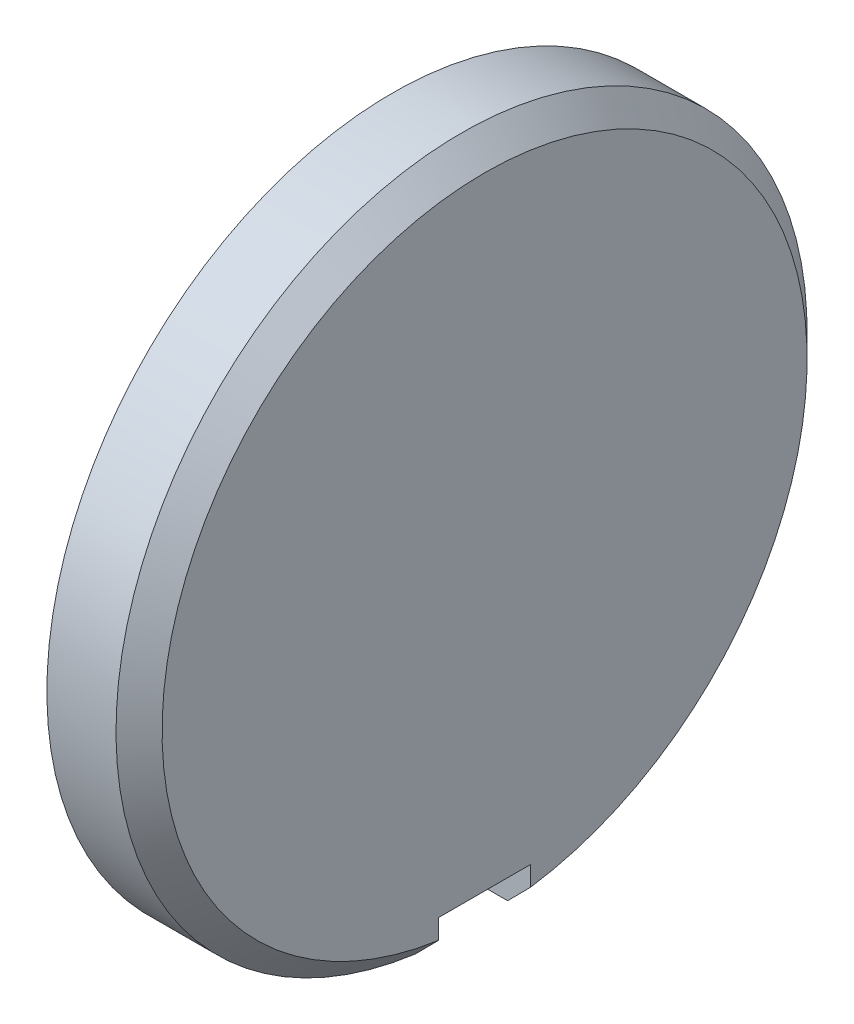
ISO-10303-21;
HEADER;
FILE_DESCRIPTION(('STEP AP214'),'2;1');
FILE_NAME('part.step','',(''),(''),'','','');
FILE_SCHEMA(('AUTOMOTIVE_DESIGN { 1 0 10303 214 1 1 1 1 }'));
ENDSEC;
DATA;
#1=APPLICATION_CONTEXT('core data for automotive mechanical design processes');
#2=APPLICATION_PROTOCOL_DEFINITION('international standard','automotive_design',2000,#1);
#3=PRODUCT_CONTEXT('',#1,'mechanical');
#4=PRODUCT('Part','Part','',(#3));
#5=PRODUCT_RELATED_PRODUCT_CATEGORY('part','',(#4));
#6=PRODUCT_DEFINITION_FORMATION('','',#4);
#7=PRODUCT_DEFINITION_CONTEXT('part definition',#1,'design');
#8=PRODUCT_DEFINITION('design','',#6,#7);
#9=PRODUCT_DEFINITION_SHAPE('','',#8);
#10=(LENGTH_UNIT() NAMED_UNIT(*) SI_UNIT(.MILLI.,.METRE.));
#11=(NAMED_UNIT(*) PLANE_ANGLE_UNIT() SI_UNIT($,.RADIAN.));
#12=(NAMED_UNIT(*) SI_UNIT($,.STERADIAN.) SOLID_ANGLE_UNIT());
#13=UNCERTAINTY_MEASURE_WITH_UNIT(LENGTH_MEASURE(1.E-05),#10,'distance_accuracy_value','');
#14=(GEOMETRIC_REPRESENTATION_CONTEXT(3) GLOBAL_UNCERTAINTY_ASSIGNED_CONTEXT((#13)) GLOBAL_UNIT_ASSIGNED_CONTEXT((#10,
#11,#12)) REPRESENTATION_CONTEXT('',''));
#15=CARTESIAN_POINT('',(0.,0.,0.));
#16=DIRECTION('',(0.,0.,1.));
#17=DIRECTION('',(1.,0.,0.));
#18=AXIS2_PLACEMENT_3D('',#15,#16,#17);
#19=CARTESIAN_POINT('',(76.8,-20.,66.));
#20=DIRECTION('',(-1.,0.,0.));
#21=DIRECTION('',(0.,0.,1.));
#22=AXIS2_PLACEMENT_3D('',#19,#20,#21);
#23=PLANE('',#22);
#24=DIRECTION('',(0.,-1.,0.));
#25=VECTOR('',#24,1.);
#26=CARTESIAN_POINT('',(76.8,-20.,66.8));
#27=LINE('',#26,#25);
#28=CARTESIAN_POINT('',(76.8,-25.2,66.8));
#29=VERTEX_POINT('',#28);
#30=CARTESIAN_POINT('',(76.8,-25.5425625842204,66.8));
#31=VERTEX_POINT('',#30);
#32=EDGE_CURVE('E210',#29,#31,#27,.T.);
#33=ORIENTED_EDGE('',*,*,#32,.F.);
#34=DIRECTION('',(0.,0.,1.));
#35=VECTOR('',#34,1.);
#36=CARTESIAN_POINT('',(76.8,-25.2,66.));
#37=LINE('',#36,#35);
#38=CARTESIAN_POINT('',(76.8,-25.2,65.2));
#39=VERTEX_POINT('',#38);
#40=EDGE_CURVE('E202',#39,#29,#37,.T.);
#41=ORIENTED_EDGE('',*,*,#40,.F.);
#42=DIRECTION('',(0.,-1.,0.));
#43=VECTOR('',#42,1.);
#44=CARTESIAN_POINT('',(76.8,-20.,65.2));
#45=LINE('',#44,#43);
#46=CARTESIAN_POINT('',(76.8,-25.5425625842204,65.2));
#47=VERTEX_POINT('',#46);
#48=EDGE_CURVE('E188',#39,#47,#45,.T.);
#49=ORIENTED_EDGE('',*,*,#48,.T.);
#50=CARTESIAN_POINT('',(76.8,-20.,66.));
#51=DIRECTION('',(-1.,0.,0.));
#52=DIRECTION('',(0.,0.,1.));
#53=AXIS2_PLACEMENT_3D('',#50,#51,#52);
#54=CIRCLE('',#53,5.6);
#55=EDGE_CURVE('E315',#31,#47,#54,.T.);
#56=ORIENTED_EDGE('',*,*,#55,.F.);
#57=EDGE_LOOP('',(#33,#41,#49,#56));
#58=FACE_BOUND('',#57,.T.);
#59=ADVANCED_FACE('F47',(#58),#23,.F.);
#60=CARTESIAN_POINT('',(76.8,-20.,66.));
#61=DIRECTION('',(-1.,0.,0.));
#62=DIRECTION('',(0.,0.,1.));
#63=AXIS2_PLACEMENT_3D('',#60,#61,#62);
#64=CONICAL_SURFACE('',#63,5.6,0.78539816339747);
#65=CARTESIAN_POINT('',(77.6946271909999,-24.6368667515551,66.8));
#66=CARTESIAN_POINT('',(77.5126166868986,-24.8215553370668,66.8));
#67=CARTESIAN_POINT('',(77.3304582431577,-25.0060979425621,66.8));
#68=CARTESIAN_POINT('',(76.9659108831408,-25.374955064313,66.8));
#69=CARTESIAN_POINT('',(76.7835219670777,-25.5592695807787,66.8));
#70=CARTESIAN_POINT('',(76.418578818597,-25.9277346494659,66.8));
#71=CARTESIAN_POINT('',(76.2360245862569,-26.1118852017641,66.8));
#72=CARTESIAN_POINT('',(75.8707866928955,-26.480058250433,66.8));
#73=CARTESIAN_POINT('',(75.6881030317566,-26.6640807466869,66.8));
#74=CARTESIAN_POINT('',(75.5053728090001,-26.8480569582091,66.8));
#75=B_SPLINE_CURVE_WITH_KNOTS('',3,(#65,#66,#67,#68,#69,#70,#71,#72,#73,#74),.UNSPECIFIED.,.F.,
.F.,(4,2,2,2,4),(0.,0.777906711944237,1.55581270618923,2.33371833583195,3.11162467374078),.UNSPECIFIED.);
#76=CARTESIAN_POINT('',(76.4,-25.9464274989274,66.8));
#77=VERTEX_POINT('',#76);
#78=EDGE_CURVE('E217',#31,#77,#75,.T.);
#79=ORIENTED_EDGE('',*,*,#78,.F.);
#80=ORIENTED_EDGE('',*,*,#55,.T.);
#81=CARTESIAN_POINT('',(77.6946271909999,-24.6368667515551,65.2));
#82=CARTESIAN_POINT('',(77.5126166868986,-24.8215553370668,65.2));
#83=CARTESIAN_POINT('',(77.3304582431577,-25.0060979425621,65.2));
#84=CARTESIAN_POINT('',(76.9659108831408,-25.374955064313,65.2));
#85=CARTESIAN_POINT('',(76.7835219670777,-25.5592695807787,65.2));
#86=CARTESIAN_POINT('',(76.418578818597,-25.9277346494659,65.2));
#87=CARTESIAN_POINT('',(76.2360245862569,-26.1118852017641,65.2));
#88=CARTESIAN_POINT('',(75.8707866928955,-26.480058250433,65.2));
#89=CARTESIAN_POINT('',(75.6881030317566,-26.6640807466869,65.2));
#90=CARTESIAN_POINT('',(75.5053728090001,-26.8480569582091,65.2));
#91=B_SPLINE_CURVE_WITH_KNOTS('',3,(#81,#82,#83,#84,#85,#86,#87,#88,#89,#90),.UNSPECIFIED.,.F.,
.F.,(4,2,2,2,4),(0.,0.777906711944237,1.55581270618923,2.33371833583195,3.11162467374078),.UNSPECIFIED.);
#92=CARTESIAN_POINT('',(76.4,-25.9464274989274,65.2));
#93=VERTEX_POINT('',#92);
#94=EDGE_CURVE('E191',#47,#93,#91,.T.);
#95=ORIENTED_EDGE('',*,*,#94,.T.);
#96=CARTESIAN_POINT('',(76.4,-20.,66.));
#97=DIRECTION('',(-1.,0.,0.));
#98=DIRECTION('',(0.,0.,1.));
#99=AXIS2_PLACEMENT_3D('',#96,#97,#98);
#100=CIRCLE('',#99,6.);
#101=EDGE_CURVE('E311',#77,#93,#100,.T.);
#102=ORIENTED_EDGE('',*,*,#101,.F.);
#103=EDGE_LOOP('',(#79,#80,#95,#102));
#104=FACE_BOUND('',#103,.T.);
#105=ADVANCED_FACE('F470',(#104),#64,.T.);
#106=CARTESIAN_POINT('',(69.,-20.,66.));
#107=DIRECTION('',(-1.,0.,0.));
#108=DIRECTION('',(0.,0.,1.));
#109=AXIS2_PLACEMENT_3D('',#106,#107,#108);
#110=CYLINDRICAL_SURFACE('',#109,6.);
#111=DIRECTION('',(-1.,0.,0.));
#112=VECTOR('',#111,1.);
#113=CARTESIAN_POINT('',(69.,-25.9464274989274,66.8));
#114=LINE('',#113,#112);
#115=CARTESIAN_POINT('',(75.2,-25.9464274989274,66.8));
#116=VERTEX_POINT('',#115);
#117=EDGE_CURVE('E197',#77,#116,#114,.T.);
#118=ORIENTED_EDGE('',*,*,#117,.F.);
#119=ORIENTED_EDGE('',*,*,#101,.T.);
#120=DIRECTION('',(-1.,0.,0.));
#121=VECTOR('',#120,1.);
#122=CARTESIAN_POINT('',(69.,-25.9464274989274,65.2));
#123=LINE('',#122,#121);
#124=CARTESIAN_POINT('',(75.2,-25.9464274989274,65.2));
#125=VERTEX_POINT('',#124);
#126=EDGE_CURVE('E679',#93,#125,#123,.T.);
#127=ORIENTED_EDGE('',*,*,#126,.T.);
#128=CARTESIAN_POINT('',(75.2,-20.,66.));
#129=DIRECTION('',(-1.,0.,0.));
#130=DIRECTION('',(0.,0.,1.));
#131=AXIS2_PLACEMENT_3D('',#128,#129,#130);
#132=CIRCLE('',#131,6.);
#133=EDGE_CURVE('E307',#116,#125,#132,.T.);
#134=ORIENTED_EDGE('',*,*,#133,.F.);
#135=EDGE_LOOP('',(#118,#119,#127,#134));
#136=FACE_BOUND('',#135,.T.);
#137=ADVANCED_FACE('F475',(#136),#110,.T.);
#138=CARTESIAN_POINT('',(75.2,-14.,66.));
#139=DIRECTION('',(1.,0.,0.));
#140=DIRECTION('',(0.,0.,-1.));
#141=AXIS2_PLACEMENT_3D('',#138,#139,#140);
#142=PLANE('',#141);
#143=CARTESIAN_POINT('',(75.2,-20.,66.));
#144=DIRECTION('',(-1.,0.,0.));
#145=DIRECTION('',(0.,0.,1.));
#146=AXIS2_PLACEMENT_3D('',#143,#144,#145);
#147=CIRCLE('',#146,3.);
#148=CARTESIAN_POINT('',(75.2,-20.,69.));
#149=VERTEX_POINT('',#148);
#150=EDGE_CURVE('E301',#149,#149,#147,.T.);
#151=ORIENTED_EDGE('',*,*,#150,.F.);
#152=EDGE_LOOP('',(#151));
#153=FACE_BOUND('',#152,.T.);
#154=DIRECTION('',(0.,1.,0.));
#155=VECTOR('',#154,1.);
#156=CARTESIAN_POINT('',(75.2,-14.,66.8));
#157=LINE('',#156,#155);
#158=CARTESIAN_POINT('',(75.2,-25.2,66.8));
#159=VERTEX_POINT('',#158);
#160=EDGE_CURVE('E11',#116,#159,#157,.T.);
#161=ORIENTED_EDGE('',*,*,#160,.F.);
#162=ORIENTED_EDGE('',*,*,#133,.T.);
#163=DIRECTION('',(0.,1.,0.));
#164=VECTOR('',#163,1.);
#165=CARTESIAN_POINT('',(75.2,-14.,65.2));
#166=LINE('',#165,#164);
#167=CARTESIAN_POINT('',(75.2,-25.2,65.2));
#168=VERTEX_POINT('',#167);
#169=EDGE_CURVE('E363',#125,#168,#166,.T.);
#170=ORIENTED_EDGE('',*,*,#169,.T.);
#171=DIRECTION('',(0.,0.,-1.));
#172=VECTOR('',#171,1.);
#173=CARTESIAN_POINT('',(75.2,-25.2,66.));
#174=LINE('',#173,#172);
#175=EDGE_CURVE('E56',#159,#168,#174,.T.);
#176=ORIENTED_EDGE('',*,*,#175,.F.);
#177=EDGE_LOOP('',(#161,#162,#170,#176));
#178=FACE_BOUND('',#177,.T.);
#179=ADVANCED_FACE('F498',(#153,#178),#142,.F.);
#180=CARTESIAN_POINT('',(74.,-17.,66.));
#181=DIRECTION('',(1.,0.,0.));
#182=DIRECTION('',(0.,0.,-1.));
#183=AXIS2_PLACEMENT_3D('',#180,#181,#182);
#184=PLANE('',#183);
#185=DIRECTION('',(0.,1.,0.));
#186=VECTOR('',#185,1.);
#187=CARTESIAN_POINT('',(74.,-17.,66.4));
#188=LINE('',#187,#186);
#189=CARTESIAN_POINT('',(74.,-22.9732137494637,66.4));
#190=VERTEX_POINT('',#189);
#191=CARTESIAN_POINT('',(74.,-22.2649503305812,66.4));
#192=VERTEX_POINT('',#191);
#193=EDGE_CURVE('E248',#190,#192,#188,.T.);
#194=ORIENTED_EDGE('',*,*,#193,.F.);
#195=CARTESIAN_POINT('',(74.,-20.,66.));
#196=DIRECTION('',(-1.,0.,0.));
#197=DIRECTION('',(0.,0.,1.));
#198=AXIS2_PLACEMENT_3D('',#195,#196,#197);
#199=CIRCLE('',#198,3.);
#200=CARTESIAN_POINT('',(74.,-20.4,68.9732137494637));
#201=VERTEX_POINT('',#200);
#202=EDGE_CURVE('E296',#190,#201,#199,.T.);
#203=ORIENTED_EDGE('',*,*,#202,.T.);
#204=DIRECTION('',(0.,0.,1.));
#205=VECTOR('',#204,1.);
#206=CARTESIAN_POINT('',(74.,-20.4,66.));
#207=LINE('',#206,#205);
#208=CARTESIAN_POINT('',(74.,-20.4,68.2649503305812));
#209=VERTEX_POINT('',#208);
#210=EDGE_CURVE('E284',#209,#201,#207,.T.);
#211=ORIENTED_EDGE('',*,*,#210,.F.);
#212=CARTESIAN_POINT('',(74.,-20.,66.));
#213=DIRECTION('',(-1.,0.,0.));
#214=DIRECTION('',(0.,0.,1.));
#215=AXIS2_PLACEMENT_3D('',#212,#213,#214);
#216=CIRCLE('',#215,2.3);
#217=EDGE_CURVE('E322',#192,#209,#216,.T.);
#218=ORIENTED_EDGE('',*,*,#217,.F.);
#219=EDGE_LOOP('',(#194,#203,#211,#218));
#220=FACE_BOUND('',#219,.T.);
#221=ADVANCED_FACE('F418',(#220),#184,.F.);
#222=DIRECTION('',(0.,1.,0.));
#223=VECTOR('',#222,1.);
#224=CARTESIAN_POINT('',(74.,-17.,66.4));
#225=LINE('',#224,#223);
#226=CARTESIAN_POINT('',(74.,-17.7350496694188,66.4));
#227=VERTEX_POINT('',#226);
#228=CARTESIAN_POINT('',(74.,-17.0267862505363,66.4));
#229=VERTEX_POINT('',#228);
#230=EDGE_CURVE('E242',#227,#229,#225,.T.);
#231=ORIENTED_EDGE('',*,*,#230,.F.);
#232=CARTESIAN_POINT('',(74.,-19.6,68.2649503305812));
#233=VERTEX_POINT('',#232);
#234=EDGE_CURVE('E323',#233,#227,#216,.T.);
#235=ORIENTED_EDGE('',*,*,#234,.F.);
#236=DIRECTION('',(0.,0.,-1.));
#237=VECTOR('',#236,1.);
#238=CARTESIAN_POINT('',(74.,-19.6,66.));
#239=LINE('',#238,#237);
#240=CARTESIAN_POINT('',(74.,-19.6,68.9732137494637));
#241=VERTEX_POINT('',#240);
#242=EDGE_CURVE('E273',#241,#233,#239,.T.);
#243=ORIENTED_EDGE('',*,*,#242,.F.);
#244=EDGE_CURVE('E297',#241,#229,#199,.T.);
#245=ORIENTED_EDGE('',*,*,#244,.T.);
#246=EDGE_LOOP('',(#231,#235,#243,#245));
#247=FACE_BOUND('',#246,.T.);
#248=ADVANCED_FACE('F436',(#247),#184,.F.);
#249=CARTESIAN_POINT('',(69.,-20.,66.));
#250=DIRECTION('',(-1.,0.,0.));
#251=DIRECTION('',(0.,0.,1.));
#252=AXIS2_PLACEMENT_3D('',#249,#250,#251);
#253=CYLINDRICAL_SURFACE('',#252,2.3);
#254=CARTESIAN_POINT('',(75.2,-20.,66.));
#255=DIRECTION('',(-1.,0.,0.));
#256=DIRECTION('',(0.,0.,1.));
#257=AXIS2_PLACEMENT_3D('',#254,#255,#256);
#258=CIRCLE('',#257,2.3);
#259=CARTESIAN_POINT('',(75.2,-20.,68.3));
#260=VERTEX_POINT('',#259);
#261=EDGE_CURVE('E318',#260,#260,#258,.T.);
#262=ORIENTED_EDGE('',*,*,#261,.F.);
#263=EDGE_LOOP('',(#262));
#264=FACE_BOUND('',#263,.T.);
#265=DIRECTION('',(-1.,0.,0.));
#266=VECTOR('',#265,1.);
#267=CARTESIAN_POINT('',(69.,-22.2649503305812,66.4));
#268=LINE('',#267,#266);
#269=CARTESIAN_POINT('',(75.18,-22.2649503305812,66.4));
#270=VERTEX_POINT('',#269);
#271=EDGE_CURVE('E251',#192,#270,#268,.F.);
#272=ORIENTED_EDGE('',*,*,#271,.F.);
#273=ORIENTED_EDGE('',*,*,#217,.T.);
#274=DIRECTION('',(-1.,0.,0.));
#275=VECTOR('',#274,1.);
#276=CARTESIAN_POINT('',(69.,-20.4,68.2649503305812));
#277=LINE('',#276,#275);
#278=CARTESIAN_POINT('',(75.18,-20.4,68.2649503305812));
#279=VERTEX_POINT('',#278);
#280=EDGE_CURVE('E288',#279,#209,#277,.T.);
#281=ORIENTED_EDGE('',*,*,#280,.F.);
#282=CARTESIAN_POINT('',(75.18,-20.,66.));
#283=DIRECTION('',(-1.,0.,0.));
#284=DIRECTION('',(0.,0.,1.));
#285=AXIS2_PLACEMENT_3D('',#282,#283,#284);
#286=CIRCLE('',#285,2.3);
#287=CARTESIAN_POINT('',(75.18,-19.6,68.2649503305812));
#288=VERTEX_POINT('',#287);
#289=EDGE_CURVE('E280',#288,#279,#286,.F.);
#290=ORIENTED_EDGE('',*,*,#289,.F.);
#291=DIRECTION('',(-1.,0.,0.));
#292=VECTOR('',#291,1.);
#293=CARTESIAN_POINT('',(69.,-19.6,68.2649503305812));
#294=LINE('',#293,#292);
#295=EDGE_CURVE('E277',#233,#288,#294,.F.);
#296=ORIENTED_EDGE('',*,*,#295,.F.);
#297=ORIENTED_EDGE('',*,*,#234,.T.);
#298=DIRECTION('',(-1.,0.,0.));
#299=VECTOR('',#298,1.);
#300=CARTESIAN_POINT('',(69.,-17.7350496694188,66.4));
#301=LINE('',#300,#299);
#302=CARTESIAN_POINT('',(75.18,-17.7350496694188,66.4));
#303=VERTEX_POINT('',#302);
#304=EDGE_CURVE('E245',#303,#227,#301,.T.);
#305=ORIENTED_EDGE('',*,*,#304,.F.);
#306=CARTESIAN_POINT('',(75.18,-20.,66.));
#307=DIRECTION('',(-1.,0.,0.));
#308=DIRECTION('',(0.,0.,1.));
#309=AXIS2_PLACEMENT_3D('',#306,#307,#308);
#310=CIRCLE('',#309,2.3);
#311=CARTESIAN_POINT('',(75.18,-17.7350496694188,65.6));
#312=VERTEX_POINT('',#311);
#313=EDGE_CURVE('E254',#312,#303,#310,.F.);
#314=ORIENTED_EDGE('',*,*,#313,.F.);
#315=DIRECTION('',(-1.,0.,0.));
#316=VECTOR('',#315,1.);
#317=CARTESIAN_POINT('',(69.,-17.7350496694188,65.6));
#318=LINE('',#317,#316);
#319=CARTESIAN_POINT('',(74.,-17.7350496694188,65.6));
#320=VERTEX_POINT('',#319);
#321=EDGE_CURVE('E230',#312,#320,#318,.T.);
#322=ORIENTED_EDGE('',*,*,#321,.T.);
#323=CARTESIAN_POINT('',(74.,-19.6,63.7350496694188));
#324=VERTEX_POINT('',#323);
#325=EDGE_CURVE('E328',#320,#324,#216,.T.);
#326=ORIENTED_EDGE('',*,*,#325,.T.);
#327=DIRECTION('',(-1.,0.,0.));
#328=VECTOR('',#327,1.);
#329=CARTESIAN_POINT('',(69.,-19.6,63.7350496694188));
#330=LINE('',#329,#328);
#331=CARTESIAN_POINT('',(75.18,-19.6,63.7350496694188));
#332=VERTEX_POINT('',#331);
#333=EDGE_CURVE('E272',#332,#324,#330,.T.);
#334=ORIENTED_EDGE('',*,*,#333,.F.);
#335=CARTESIAN_POINT('',(75.18,-20.4,63.7350496694188));
#336=VERTEX_POINT('',#335);
#337=EDGE_CURVE('E283',#336,#332,#286,.F.);
#338=ORIENTED_EDGE('',*,*,#337,.F.);
#339=DIRECTION('',(-1.,0.,0.));
#340=VECTOR('',#339,1.);
#341=CARTESIAN_POINT('',(69.,-20.4,63.7350496694188));
#342=LINE('',#341,#340);
#343=CARTESIAN_POINT('',(74.,-20.4,63.7350496694188));
#344=VERTEX_POINT('',#343);
#345=EDGE_CURVE('E293',#344,#336,#342,.F.);
#346=ORIENTED_EDGE('',*,*,#345,.F.);
#347=CARTESIAN_POINT('',(74.,-22.2649503305812,65.6));
#348=VERTEX_POINT('',#347);
#349=EDGE_CURVE('E329',#344,#348,#216,.T.);
#350=ORIENTED_EDGE('',*,*,#349,.T.);
#351=DIRECTION('',(-1.,0.,0.));
#352=VECTOR('',#351,1.);
#353=CARTESIAN_POINT('',(69.,-22.2649503305812,65.6));
#354=LINE('',#353,#352);
#355=CARTESIAN_POINT('',(75.18,-22.2649503305812,65.6));
#356=VERTEX_POINT('',#355);
#357=EDGE_CURVE('E238',#348,#356,#354,.F.);
#358=ORIENTED_EDGE('',*,*,#357,.T.);
#359=EDGE_CURVE('E257',#270,#356,#310,.F.);
#360=ORIENTED_EDGE('',*,*,#359,.F.);
#361=EDGE_LOOP('',(#272,#273,#281,#290,#296,#297,#305,#314,#322,#326,#334,#338,#346,#350,#358,#360));
#362=FACE_BOUND('',#361,.T.);
#363=ADVANCED_FACE('F397',(#264,#362),#253,.F.);
#364=CARTESIAN_POINT('',(69.,-20.,66.));
#365=DIRECTION('',(-1.,0.,0.));
#366=DIRECTION('',(0.,0.,1.));
#367=AXIS2_PLACEMENT_3D('',#364,#365,#366);
#368=CYLINDRICAL_SURFACE('',#367,3.);
#369=ORIENTED_EDGE('',*,*,#150,.T.);
#370=EDGE_LOOP('',(#369));
#371=FACE_BOUND('',#370,.T.);
#372=DIRECTION('',(-1.,0.,0.));
#373=VECTOR('',#372,1.);
#374=CARTESIAN_POINT('',(69.,-22.9732137494637,66.4));
#375=LINE('',#374,#373);
#376=CARTESIAN_POINT('',(75.18,-22.9732137494637,66.4));
#377=VERTEX_POINT('',#376);
#378=EDGE_CURVE('E360',#377,#190,#375,.T.);
#379=ORIENTED_EDGE('',*,*,#378,.F.);
#380=CARTESIAN_POINT('',(75.18,-20.,66.));
#381=DIRECTION('',(-1.,0.,0.));
#382=DIRECTION('',(0.,0.,1.));
#383=AXIS2_PLACEMENT_3D('',#380,#381,#382);
#384=CIRCLE('',#383,3.);
#385=CARTESIAN_POINT('',(75.18,-22.9732137494637,65.6));
#386=VERTEX_POINT('',#385);
#387=EDGE_CURVE('E353',#386,#377,#384,.T.);
#388=ORIENTED_EDGE('',*,*,#387,.F.);
#389=DIRECTION('',(-1.,0.,0.));
#390=VECTOR('',#389,1.);
#391=CARTESIAN_POINT('',(69.,-22.9732137494637,65.6));
#392=LINE('',#391,#390);
#393=CARTESIAN_POINT('',(74.,-22.9732137494637,65.6));
#394=VERTEX_POINT('',#393);
#395=EDGE_CURVE('E356',#386,#394,#392,.T.);
#396=ORIENTED_EDGE('',*,*,#395,.T.);
#397=CARTESIAN_POINT('',(74.,-20.4,63.0267862505363));
#398=VERTEX_POINT('',#397);
#399=EDGE_CURVE('E303',#398,#394,#199,.T.);
#400=ORIENTED_EDGE('',*,*,#399,.F.);
#401=DIRECTION('',(-1.,0.,0.));
#402=VECTOR('',#401,1.);
#403=CARTESIAN_POINT('',(69.,-20.4,63.0267862505363));
#404=LINE('',#403,#402);
#405=CARTESIAN_POINT('',(75.18,-20.4,63.0267862505363));
#406=VERTEX_POINT('',#405);
#407=EDGE_CURVE('E335',#406,#398,#404,.T.);
#408=ORIENTED_EDGE('',*,*,#407,.F.);
#409=CARTESIAN_POINT('',(75.18,-20.,66.));
#410=DIRECTION('',(-1.,0.,0.));
#411=DIRECTION('',(0.,0.,1.));
#412=AXIS2_PLACEMENT_3D('',#409,#410,#411);
#413=CIRCLE('',#412,3.);
#414=CARTESIAN_POINT('',(75.18,-19.6,63.0267862505363));
#415=VERTEX_POINT('',#414);
#416=EDGE_CURVE('E332',#415,#406,#413,.T.);
#417=ORIENTED_EDGE('',*,*,#416,.F.);
#418=DIRECTION('',(-1.,0.,0.));
#419=VECTOR('',#418,1.);
#420=CARTESIAN_POINT('',(69.,-19.6,63.0267862505363));
#421=LINE('',#420,#419);
#422=CARTESIAN_POINT('',(74.,-19.6,63.0267862505363));
#423=VERTEX_POINT('',#422);
#424=EDGE_CURVE('E327',#423,#415,#421,.F.);
#425=ORIENTED_EDGE('',*,*,#424,.F.);
#426=CARTESIAN_POINT('',(74.,-17.0267862505363,65.6));
#427=VERTEX_POINT('',#426);
#428=EDGE_CURVE('E302',#427,#423,#199,.T.);
#429=ORIENTED_EDGE('',*,*,#428,.F.);
#430=DIRECTION('',(-1.,0.,0.));
#431=VECTOR('',#430,1.);
#432=CARTESIAN_POINT('',(69.,-17.0267862505363,65.6));
#433=LINE('',#432,#431);
#434=CARTESIAN_POINT('',(75.18,-17.0267862505363,65.6));
#435=VERTEX_POINT('',#434);
#436=EDGE_CURVE('E345',#427,#435,#433,.F.);
#437=ORIENTED_EDGE('',*,*,#436,.T.);
#438=CARTESIAN_POINT('',(75.18,-17.0267862505363,66.4));
#439=VERTEX_POINT('',#438);
#440=EDGE_CURVE('E349',#439,#435,#384,.T.);
#441=ORIENTED_EDGE('',*,*,#440,.F.);
#442=DIRECTION('',(-1.,0.,0.));
#443=VECTOR('',#442,1.);
#444=CARTESIAN_POINT('',(69.,-17.0267862505363,66.4));
#445=LINE('',#444,#443);
#446=EDGE_CURVE('E352',#229,#439,#445,.F.);
#447=ORIENTED_EDGE('',*,*,#446,.F.);
#448=ORIENTED_EDGE('',*,*,#244,.F.);
#449=DIRECTION('',(-1.,0.,0.));
#450=VECTOR('',#449,1.);
#451=CARTESIAN_POINT('',(69.,-19.6,68.9732137494637));
#452=LINE('',#451,#450);
#453=CARTESIAN_POINT('',(75.18,-19.6,68.9732137494637));
#454=VERTEX_POINT('',#453);
#455=EDGE_CURVE('E339',#454,#241,#452,.T.);
#456=ORIENTED_EDGE('',*,*,#455,.F.);
#457=CARTESIAN_POINT('',(75.18,-20.4,68.9732137494637));
#458=VERTEX_POINT('',#457);
#459=EDGE_CURVE('E336',#458,#454,#413,.T.);
#460=ORIENTED_EDGE('',*,*,#459,.F.);
#461=DIRECTION('',(-1.,0.,0.));
#462=VECTOR('',#461,1.);
#463=CARTESIAN_POINT('',(69.,-20.4,68.9732137494637));
#464=LINE('',#463,#462);
#465=EDGE_CURVE('E342',#201,#458,#464,.F.);
#466=ORIENTED_EDGE('',*,*,#465,.F.);
#467=ORIENTED_EDGE('',*,*,#202,.F.);
#468=EDGE_LOOP('',(#379,#388,#396,#400,#408,#417,#425,#429,#437,#441,#447,#448,#456,#460,#466,#467));
#469=FACE_BOUND('',#468,.T.);
#470=ADVANCED_FACE('F406',(#371,#469),#368,.T.);
#471=ORIENTED_EDGE('',*,*,#399,.T.);
#472=DIRECTION('',(0.,1.,0.));
#473=VECTOR('',#472,1.);
#474=CARTESIAN_POINT('',(74.,-17.,65.6));
#475=LINE('',#474,#473);
#476=EDGE_CURVE('E234',#394,#348,#475,.T.);
#477=ORIENTED_EDGE('',*,*,#476,.T.);
#478=ORIENTED_EDGE('',*,*,#349,.F.);
#479=EDGE_CURVE('E289',#398,#344,#207,.T.);
#480=ORIENTED_EDGE('',*,*,#479,.F.);
#481=EDGE_LOOP('',(#471,#477,#478,#480));
#482=FACE_BOUND('',#481,.T.);
#483=ADVANCED_FACE('F49',(#482),#184,.F.);
#484=ORIENTED_EDGE('',*,*,#325,.F.);
#485=DIRECTION('',(0.,1.,0.));
#486=VECTOR('',#485,1.);
#487=CARTESIAN_POINT('',(74.,-17.,65.6));
#488=LINE('',#487,#486);
#489=EDGE_CURVE('E226',#320,#427,#488,.T.);
#490=ORIENTED_EDGE('',*,*,#489,.T.);
#491=ORIENTED_EDGE('',*,*,#428,.T.);
#492=EDGE_CURVE('E268',#324,#423,#239,.T.);
#493=ORIENTED_EDGE('',*,*,#492,.F.);
#494=EDGE_LOOP('',(#484,#490,#491,#493));
#495=FACE_BOUND('',#494,.T.);
#496=ADVANCED_FACE('F450',(#495),#184,.F.);
#497=CARTESIAN_POINT('',(75.2,-17.7,66.));
#498=DIRECTION('',(1.,0.,0.));
#499=DIRECTION('',(0.,0.,-1.));
#500=AXIS2_PLACEMENT_3D('',#497,#498,#499);
#501=PLANE('',#500);
#502=ORIENTED_EDGE('',*,*,#261,.T.);
#503=EDGE_LOOP('',(#502));
#504=FACE_BOUND('',#503,.T.);
#505=ADVANCED_FACE('F481',(#504),#501,.F.);
#506=CARTESIAN_POINT('',(73.9,-19.6,69.2));
#507=DIRECTION('',(0.,-1.,0.));
#508=DIRECTION('',(0.,0.,-1.));
#509=AXIS2_PLACEMENT_3D('',#506,#507,#508);
#510=PLANE('',#509);
#511=ORIENTED_EDGE('',*,*,#333,.T.);
#512=ORIENTED_EDGE('',*,*,#492,.T.);
#513=ORIENTED_EDGE('',*,*,#424,.T.);
#514=DIRECTION('',(0.,0.,-1.));
#515=VECTOR('',#514,1.);
#516=CARTESIAN_POINT('',(75.18,-19.6,69.2));
#517=LINE('',#516,#515);
#518=EDGE_CURVE('E258',#332,#415,#517,.T.);
#519=ORIENTED_EDGE('',*,*,#518,.F.);
#520=EDGE_LOOP('',(#511,#512,#513,#519));
#521=FACE_BOUND('',#520,.T.);
#522=ADVANCED_FACE('F453',(#521),#510,.T.);
#523=CARTESIAN_POINT('',(75.18,-20.4,69.2));
#524=DIRECTION('',(-1.,0.,0.));
#525=DIRECTION('',(0.,0.,1.));
#526=AXIS2_PLACEMENT_3D('',#523,#524,#525);
#527=PLANE('',#526);
#528=ORIENTED_EDGE('',*,*,#337,.T.);
#529=ORIENTED_EDGE('',*,*,#518,.T.);
#530=ORIENTED_EDGE('',*,*,#416,.T.);
#531=DIRECTION('',(0.,0.,-1.));
#532=VECTOR('',#531,1.);
#533=CARTESIAN_POINT('',(75.18,-20.4,69.2));
#534=LINE('',#533,#532);
#535=EDGE_CURVE('E263',#336,#406,#534,.T.);
#536=ORIENTED_EDGE('',*,*,#535,.F.);
#537=EDGE_LOOP('',(#528,#529,#530,#536));
#538=FACE_BOUND('',#537,.T.);
#539=ADVANCED_FACE('F458',(#538),#527,.T.);
#540=CARTESIAN_POINT('',(73.9,-20.4,69.2));
#541=DIRECTION('',(0.,1.,0.));
#542=DIRECTION('',(0.,0.,1.));
#543=AXIS2_PLACEMENT_3D('',#540,#541,#542);
#544=PLANE('',#543);
#545=ORIENTED_EDGE('',*,*,#345,.T.);
#546=ORIENTED_EDGE('',*,*,#535,.T.);
#547=ORIENTED_EDGE('',*,*,#407,.T.);
#548=ORIENTED_EDGE('',*,*,#479,.T.);
#549=EDGE_LOOP('',(#545,#546,#547,#548));
#550=FACE_BOUND('',#549,.T.);
#551=ADVANCED_FACE('F460',(#550),#544,.T.);
#552=ORIENTED_EDGE('',*,*,#280,.T.);
#553=ORIENTED_EDGE('',*,*,#210,.T.);
#554=ORIENTED_EDGE('',*,*,#465,.T.);
#555=EDGE_CURVE('E267',#458,#279,#534,.T.);
#556=ORIENTED_EDGE('',*,*,#555,.T.);
#557=EDGE_LOOP('',(#552,#553,#554,#556));
#558=FACE_BOUND('',#557,.T.);
#559=ADVANCED_FACE('F421',(#558),#544,.T.);
#560=ORIENTED_EDGE('',*,*,#289,.T.);
#561=ORIENTED_EDGE('',*,*,#555,.F.);
#562=ORIENTED_EDGE('',*,*,#459,.T.);
#563=EDGE_CURVE('E262',#454,#288,#517,.T.);
#564=ORIENTED_EDGE('',*,*,#563,.T.);
#565=EDGE_LOOP('',(#560,#561,#562,#564));
#566=FACE_BOUND('',#565,.T.);
#567=ADVANCED_FACE('F427',(#566),#527,.T.);
#568=ORIENTED_EDGE('',*,*,#295,.T.);
#569=ORIENTED_EDGE('',*,*,#563,.F.);
#570=ORIENTED_EDGE('',*,*,#455,.T.);
#571=ORIENTED_EDGE('',*,*,#242,.T.);
#572=EDGE_LOOP('',(#568,#569,#570,#571));
#573=FACE_BOUND('',#572,.T.);
#574=ADVANCED_FACE('F539',(#573),#510,.T.);
#575=CARTESIAN_POINT('',(0.,0.,66.4));
#576=DIRECTION('',(0.,0.,-1.));
#577=DIRECTION('',(-1.,0.,0.));
#578=AXIS2_PLACEMENT_3D('',#575,#576,#577);
#579=PLANE('',#578);
#580=ORIENTED_EDGE('',*,*,#304,.T.);
#581=ORIENTED_EDGE('',*,*,#230,.T.);
#582=ORIENTED_EDGE('',*,*,#446,.T.);
#583=DIRECTION('',(0.,1.,0.));
#584=VECTOR('',#583,1.);
#585=CARTESIAN_POINT('',(75.18,-23.2,66.4));
#586=LINE('',#585,#584);
#587=EDGE_CURVE('E221',#303,#439,#586,.T.);
#588=ORIENTED_EDGE('',*,*,#587,.F.);
#589=EDGE_LOOP('',(#580,#581,#582,#588));
#590=FACE_BOUND('',#589,.T.);
#591=ADVANCED_FACE('F439',(#590),#579,.T.);
#592=CARTESIAN_POINT('',(0.,0.,65.6));
#593=DIRECTION('',(0.,0.,-1.));
#594=DIRECTION('',(-1.,0.,0.));
#595=AXIS2_PLACEMENT_3D('',#592,#593,#594);
#596=PLANE('',#595);
#597=DIRECTION('',(0.,1.,0.));
#598=VECTOR('',#597,1.);
#599=CARTESIAN_POINT('',(75.18,-23.2,65.6));
#600=LINE('',#599,#598);
#601=EDGE_CURVE('E71',#312,#435,#600,.T.);
#602=ORIENTED_EDGE('',*,*,#601,.T.);
#603=ORIENTED_EDGE('',*,*,#436,.F.);
#604=ORIENTED_EDGE('',*,*,#489,.F.);
#605=ORIENTED_EDGE('',*,*,#321,.F.);
#606=EDGE_LOOP('',(#602,#603,#604,#605));
#607=FACE_BOUND('',#606,.T.);
#608=ADVANCED_FACE('F564',(#607),#596,.F.);
#609=CARTESIAN_POINT('',(75.18,-23.2,66.4));
#610=DIRECTION('',(-1.,0.,0.));
#611=DIRECTION('',(0.,0.,1.));
#612=AXIS2_PLACEMENT_3D('',#609,#610,#611);
#613=PLANE('',#612);
#614=ORIENTED_EDGE('',*,*,#313,.T.);
#615=ORIENTED_EDGE('',*,*,#587,.T.);
#616=ORIENTED_EDGE('',*,*,#440,.T.);
#617=ORIENTED_EDGE('',*,*,#601,.F.);
#618=EDGE_LOOP('',(#614,#615,#616,#617));
#619=FACE_BOUND('',#618,.T.);
#620=ADVANCED_FACE('F444',(#619),#613,.T.);
#621=ORIENTED_EDGE('',*,*,#359,.T.);
#622=EDGE_CURVE('E215',#386,#356,#600,.T.);
#623=ORIENTED_EDGE('',*,*,#622,.F.);
#624=ORIENTED_EDGE('',*,*,#387,.T.);
#625=EDGE_CURVE('E224',#377,#270,#586,.T.);
#626=ORIENTED_EDGE('',*,*,#625,.T.);
#627=EDGE_LOOP('',(#621,#623,#624,#626));
#628=FACE_BOUND('',#627,.T.);
#629=ADVANCED_FACE('F410',(#628),#613,.T.);
#630=ORIENTED_EDGE('',*,*,#271,.T.);
#631=ORIENTED_EDGE('',*,*,#625,.F.);
#632=ORIENTED_EDGE('',*,*,#378,.T.);
#633=ORIENTED_EDGE('',*,*,#193,.T.);
#634=EDGE_LOOP('',(#630,#631,#632,#633));
#635=FACE_BOUND('',#634,.T.);
#636=ADVANCED_FACE('F412',(#635),#579,.T.);
#637=ORIENTED_EDGE('',*,*,#476,.F.);
#638=ORIENTED_EDGE('',*,*,#395,.F.);
#639=ORIENTED_EDGE('',*,*,#622,.T.);
#640=ORIENTED_EDGE('',*,*,#357,.F.);
#641=EDGE_LOOP('',(#637,#638,#639,#640));
#642=FACE_BOUND('',#641,.T.);
#643=ADVANCED_FACE('F391',(#642),#596,.F.);
#644=CARTESIAN_POINT('',(75.1,-25.2,66.8));
#645=DIRECTION('',(0.,-1.,0.));
#646=DIRECTION('',(0.,0.,-1.));
#647=AXIS2_PLACEMENT_3D('',#644,#645,#646);
#648=PLANE('',#647);
#649=ORIENTED_EDGE('',*,*,#40,.T.);
#650=DIRECTION('',(-1.,0.,0.));
#651=VECTOR('',#650,1.);
#652=CARTESIAN_POINT('',(75.1,-25.2,66.8));
#653=LINE('',#652,#651);
#654=EDGE_CURVE('E207',#29,#159,#653,.T.);
#655=ORIENTED_EDGE('',*,*,#654,.T.);
#656=ORIENTED_EDGE('',*,*,#175,.T.);
#657=DIRECTION('',(-1.,0.,0.));
#658=VECTOR('',#657,1.);
#659=CARTESIAN_POINT('',(75.1,-25.2,65.2));
#660=LINE('',#659,#658);
#661=EDGE_CURVE('E63',#39,#168,#660,.T.);
#662=ORIENTED_EDGE('',*,*,#661,.F.);
#663=EDGE_LOOP('',(#649,#655,#656,#662));
#664=FACE_BOUND('',#663,.T.);
#665=ADVANCED_FACE('F200',(#664),#648,.T.);
#666=CARTESIAN_POINT('',(0.,0.,66.8));
#667=DIRECTION('',(0.,0.,-1.));
#668=DIRECTION('',(-1.,0.,0.));
#669=AXIS2_PLACEMENT_3D('',#666,#667,#668);
#670=PLANE('',#669);
#671=ORIENTED_EDGE('',*,*,#32,.T.);
#672=ORIENTED_EDGE('',*,*,#78,.T.);
#673=ORIENTED_EDGE('',*,*,#117,.T.);
#674=ORIENTED_EDGE('',*,*,#160,.T.);
#675=ORIENTED_EDGE('',*,*,#654,.F.);
#676=EDGE_LOOP('',(#671,#672,#673,#674,#675));
#677=FACE_BOUND('',#676,.T.);
#678=ADVANCED_FACE('F648',(#677),#670,.T.);
#679=CARTESIAN_POINT('',(0.,0.,65.2));
#680=DIRECTION('',(0.,0.,-1.));
#681=DIRECTION('',(-1.,0.,0.));
#682=AXIS2_PLACEMENT_3D('',#679,#680,#681);
#683=PLANE('',#682);
#684=ORIENTED_EDGE('',*,*,#661,.T.);
#685=ORIENTED_EDGE('',*,*,#169,.F.);
#686=ORIENTED_EDGE('',*,*,#126,.F.);
#687=ORIENTED_EDGE('',*,*,#94,.F.);
#688=ORIENTED_EDGE('',*,*,#48,.F.);
#689=EDGE_LOOP('',(#684,#685,#686,#687,#688));
#690=FACE_BOUND('',#689,.T.);
#691=ADVANCED_FACE('F189',(#690),#683,.F.);
#692=CLOSED_SHELL('',(#59,#105,#137,#179,#221,#248,#363,#470,#483,#496,#505,#522,#539,#551,#559,
#567,#574,#591,#608,#620,#629,#636,#643,#665,#678,#691));
#693=MANIFOLD_SOLID_BREP('B2',#692);
#694=ADVANCED_BREP_SHAPE_REPRESENTATION('',(#18,#693),#14);
#695=SHAPE_DEFINITION_REPRESENTATION(#9,#694);
ENDSEC;
END-ISO-10303-21;
